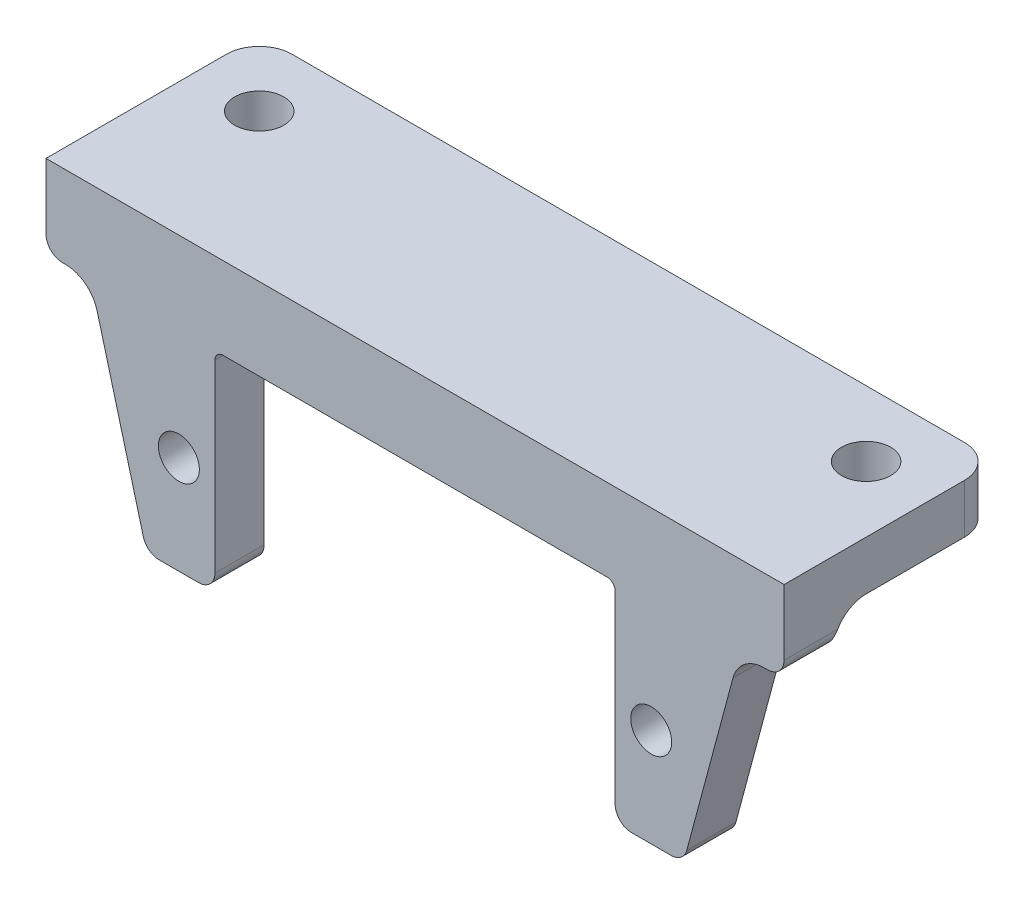
ISO-10303-21;
HEADER;
FILE_DESCRIPTION(('STEP AP214'),'2;1');
FILE_NAME('part.step','',(''),(''),'','','');
FILE_SCHEMA(('AUTOMOTIVE_DESIGN { 1 0 10303 214 1 1 1 1 }'));
ENDSEC;
DATA;
#1=APPLICATION_CONTEXT('core data for automotive mechanical design processes');
#2=APPLICATION_PROTOCOL_DEFINITION('international standard','automotive_design',2000,#1);
#3=PRODUCT_CONTEXT('',#1,'mechanical');
#4=PRODUCT('Part','Part','',(#3));
#5=PRODUCT_RELATED_PRODUCT_CATEGORY('part','',(#4));
#6=PRODUCT_DEFINITION_FORMATION('','',#4);
#7=PRODUCT_DEFINITION_CONTEXT('part definition',#1,'design');
#8=PRODUCT_DEFINITION('design','',#6,#7);
#9=PRODUCT_DEFINITION_SHAPE('','',#8);
#10=(LENGTH_UNIT() NAMED_UNIT(*) SI_UNIT(.MILLI.,.METRE.));
#11=(NAMED_UNIT(*) PLANE_ANGLE_UNIT() SI_UNIT($,.RADIAN.));
#12=(NAMED_UNIT(*) SI_UNIT($,.STERADIAN.) SOLID_ANGLE_UNIT());
#13=UNCERTAINTY_MEASURE_WITH_UNIT(LENGTH_MEASURE(1.E-05),#10,'distance_accuracy_value','');
#14=(GEOMETRIC_REPRESENTATION_CONTEXT(3) GLOBAL_UNCERTAINTY_ASSIGNED_CONTEXT((#13)) GLOBAL_UNIT_ASSIGNED_CONTEXT((#10,
#11,#12)) REPRESENTATION_CONTEXT('',''));
#15=CARTESIAN_POINT('',(0.,0.,0.));
#16=DIRECTION('',(0.,0.,1.));
#17=DIRECTION('',(1.,0.,0.));
#18=AXIS2_PLACEMENT_3D('',#15,#16,#17);
#19=CARTESIAN_POINT('',(15.6,-5.,0.));
#20=DIRECTION('',(0.,0.,-1.));
#21=DIRECTION('',(-1.,0.,0.));
#22=AXIS2_PLACEMENT_3D('',#19,#20,#21);
#23=PLANE('',#22);
#24=CARTESIAN_POINT('',(-14.4,0.,0.));
#25=DIRECTION('',(0.,0.,1.));
#26=DIRECTION('',(1.,0.,0.));
#27=AXIS2_PLACEMENT_3D('',#24,#25,#26);
#28=CIRCLE('',#27,1.25);
#29=CARTESIAN_POINT('',(-13.15,0.,0.));
#30=VERTEX_POINT('',#29);
#31=EDGE_CURVE('E312',#30,#30,#28,.T.);
#32=ORIENTED_EDGE('',*,*,#31,.T.);
#33=EDGE_LOOP('',(#32));
#34=FACE_BOUND('',#33,.T.);
#35=CARTESIAN_POINT('',(-21.3183331674337,4.75,0.));
#36=DIRECTION('',(0.,0.,-1.));
#37=DIRECTION('',(1.,0.,0.));
#38=AXIS2_PLACEMENT_3D('',#35,#36,#37);
#39=CIRCLE('',#38,2.);
#40=CARTESIAN_POINT('',(-21.3183331674337,6.75,0.));
#41=VERTEX_POINT('',#40);
#42=CARTESIAN_POINT('',(-19.3864815148555,5.26763809020503,0.));
#43=VERTEX_POINT('',#42);
#44=EDGE_CURVE('E370',#41,#43,#39,.T.);
#45=ORIENTED_EDGE('',*,*,#44,.F.);
#46=DIRECTION('',(-1.,0.,0.));
#47=VECTOR('',#46,1.);
#48=CARTESIAN_POINT('',(15.6,6.75,0.));
#49=LINE('',#48,#47);
#50=CARTESIAN_POINT('',(-11.7,6.75,0.));
#51=VERTEX_POINT('',#50);
#52=EDGE_CURVE('E242',#41,#51,#49,.F.);
#53=ORIENTED_EDGE('',*,*,#52,.T.);
#54=CARTESIAN_POINT('',(-11.7,6.25,0.));
#55=DIRECTION('',(0.,0.,-1.));
#56=DIRECTION('',(1.,0.,0.));
#57=AXIS2_PLACEMENT_3D('',#54,#55,#56);
#58=CIRCLE('',#57,0.5);
#59=CARTESIAN_POINT('',(-12.2,6.25,0.));
#60=VERTEX_POINT('',#59);
#61=EDGE_CURVE('E382',#60,#51,#58,.T.);
#62=ORIENTED_EDGE('',*,*,#61,.F.);
#63=DIRECTION('',(0.,1.,0.));
#64=VECTOR('',#63,1.);
#65=CARTESIAN_POINT('',(-12.2,6.25,0.));
#66=LINE('',#65,#64);
#67=CARTESIAN_POINT('',(-12.2,-5.,0.));
#68=VERTEX_POINT('',#67);
#69=EDGE_CURVE('E380',#68,#60,#66,.T.);
#70=ORIENTED_EDGE('',*,*,#69,.F.);
#71=CARTESIAN_POINT('',(-13.2,-5.,0.));
#72=DIRECTION('',(0.,0.,1.));
#73=DIRECTION('',(-1.,0.,0.));
#74=AXIS2_PLACEMENT_3D('',#71,#72,#73);
#75=CIRCLE('',#74,0.999999999999999);
#76=CARTESIAN_POINT('',(-13.2,-6.,0.));
#77=VERTEX_POINT('',#76);
#78=EDGE_CURVE('E378',#77,#68,#75,.T.);
#79=ORIENTED_EDGE('',*,*,#78,.F.);
#80=DIRECTION('',(1.,0.,0.));
#81=VECTOR('',#80,1.);
#82=CARTESIAN_POINT('',(-13.2,-6.,0.));
#83=LINE('',#82,#81);
#84=CARTESIAN_POINT('',(-15.6,-6.,0.));
#85=VERTEX_POINT('',#84);
#86=EDGE_CURVE('E376',#85,#77,#83,.T.);
#87=ORIENTED_EDGE('',*,*,#86,.F.);
#88=CARTESIAN_POINT('',(-15.6,-5.,0.));
#89=DIRECTION('',(0.,0.,1.));
#90=DIRECTION('',(-1.,0.,0.));
#91=AXIS2_PLACEMENT_3D('',#88,#89,#90);
#92=CIRCLE('',#91,0.999999999999999);
#93=CARTESIAN_POINT('',(-16.5659258262891,-5.25881904510252,0.));
#94=VERTEX_POINT('',#93);
#95=EDGE_CURVE('E374',#94,#85,#92,.T.);
#96=ORIENTED_EDGE('',*,*,#95,.F.);
#97=DIRECTION('',(0.258819045102518,-0.965925826289069,0.));
#98=VECTOR('',#97,1.);
#99=CARTESIAN_POINT('',(-16.5659258262891,-5.25881904510252,0.));
#100=LINE('',#99,#98);
#101=EDGE_CURVE('E372',#43,#94,#100,.T.);
#102=ORIENTED_EDGE('',*,*,#101,.F.);
#103=EDGE_LOOP('',(#45,#53,#62,#70,#79,#87,#96,#102));
#104=FACE_BOUND('',#103,.T.);
#105=ADVANCED_FACE('F33',(#34,#104),#23,.T.);
#106=CARTESIAN_POINT('',(15.6,-5.,3.));
#107=DIRECTION('',(0.,0.,-1.));
#108=DIRECTION('',(-1.,0.,0.));
#109=AXIS2_PLACEMENT_3D('',#106,#107,#108);
#110=PLANE('',#109);
#111=CARTESIAN_POINT('',(15.6,-5.,3.));
#112=DIRECTION('',(0.,0.,1.));
#113=DIRECTION('',(-1.,0.,0.));
#114=AXIS2_PLACEMENT_3D('',#111,#112,#113);
#115=CIRCLE('',#114,1.);
#116=CARTESIAN_POINT('',(15.6,-6.,3.));
#117=VERTEX_POINT('',#116);
#118=CARTESIAN_POINT('',(16.5659258262891,-5.25881904510252,3.));
#119=VERTEX_POINT('',#118);
#120=EDGE_CURVE('E217',#117,#119,#115,.T.);
#121=ORIENTED_EDGE('',*,*,#120,.T.);
#122=DIRECTION('',(0.258819045102518,0.965925826289069,0.));
#123=VECTOR('',#122,1.);
#124=CARTESIAN_POINT('',(16.5659258262891,-5.25881904510252,3.));
#125=LINE('',#124,#123);
#126=CARTESIAN_POINT('',(19.3864815148555,5.26763809020502,3.));
#127=VERTEX_POINT('',#126);
#128=EDGE_CURVE('E206',#119,#127,#125,.T.);
#129=ORIENTED_EDGE('',*,*,#128,.T.);
#130=CARTESIAN_POINT('',(21.3183331674337,4.75,3.));
#131=DIRECTION('',(0.,0.,-1.));
#132=DIRECTION('',(1.,0.,0.));
#133=AXIS2_PLACEMENT_3D('',#130,#131,#132);
#134=CIRCLE('',#133,2.);
#135=CARTESIAN_POINT('',(21.3183331674337,6.75,3.));
#136=VERTEX_POINT('',#135);
#137=EDGE_CURVE('E216',#127,#136,#134,.T.);
#138=ORIENTED_EDGE('',*,*,#137,.T.);
#139=DIRECTION('',(1.,0.,0.));
#140=VECTOR('',#139,1.);
#141=CARTESIAN_POINT('',(21.3183331674337,6.75,3.));
#142=LINE('',#141,#140);
#143=CARTESIAN_POINT('',(21.5,6.75,3.));
#144=VERTEX_POINT('',#143);
#145=EDGE_CURVE('E322',#136,#144,#142,.T.);
#146=ORIENTED_EDGE('',*,*,#145,.T.);
#147=CARTESIAN_POINT('',(21.5,7.75,3.));
#148=DIRECTION('',(0.,0.,1.));
#149=DIRECTION('',(-1.,0.,0.));
#150=AXIS2_PLACEMENT_3D('',#147,#148,#149);
#151=CIRCLE('',#150,1.);
#152=CARTESIAN_POINT('',(22.5,7.75,3.));
#153=VERTEX_POINT('',#152);
#154=EDGE_CURVE('E324',#144,#153,#151,.T.);
#155=ORIENTED_EDGE('',*,*,#154,.T.);
#156=DIRECTION('',(0.,1.,0.));
#157=VECTOR('',#156,1.);
#158=CARTESIAN_POINT('',(22.5,7.75,3.));
#159=LINE('',#158,#157);
#160=CARTESIAN_POINT('',(22.5,11.75,3.));
#161=VERTEX_POINT('',#160);
#162=EDGE_CURVE('E326',#153,#161,#159,.T.);
#163=ORIENTED_EDGE('',*,*,#162,.T.);
#164=DIRECTION('',(-1.,0.,0.));
#165=VECTOR('',#164,1.);
#166=CARTESIAN_POINT('',(-22.5,11.75,3.));
#167=LINE('',#166,#165);
#168=CARTESIAN_POINT('',(-22.5,11.75,3.));
#169=VERTEX_POINT('',#168);
#170=EDGE_CURVE('E328',#161,#169,#167,.T.);
#171=ORIENTED_EDGE('',*,*,#170,.T.);
#172=DIRECTION('',(0.,-1.,0.));
#173=VECTOR('',#172,1.);
#174=CARTESIAN_POINT('',(-22.5,7.75,3.));
#175=LINE('',#174,#173);
#176=CARTESIAN_POINT('',(-22.5,7.75,3.));
#177=VERTEX_POINT('',#176);
#178=EDGE_CURVE('E330',#169,#177,#175,.T.);
#179=ORIENTED_EDGE('',*,*,#178,.T.);
#180=CARTESIAN_POINT('',(-21.5,7.75,3.));
#181=DIRECTION('',(0.,0.,1.));
#182=DIRECTION('',(-1.,0.,0.));
#183=AXIS2_PLACEMENT_3D('',#180,#181,#182);
#184=CIRCLE('',#183,1.);
#185=CARTESIAN_POINT('',(-21.5,6.75,3.));
#186=VERTEX_POINT('',#185);
#187=EDGE_CURVE('E332',#177,#186,#184,.T.);
#188=ORIENTED_EDGE('',*,*,#187,.T.);
#189=DIRECTION('',(1.,0.,0.));
#190=VECTOR('',#189,1.);
#191=CARTESIAN_POINT('',(-21.3183331674337,6.75,3.));
#192=LINE('',#191,#190);
#193=CARTESIAN_POINT('',(-21.3183331674337,6.75,3.));
#194=VERTEX_POINT('',#193);
#195=EDGE_CURVE('E334',#186,#194,#192,.T.);
#196=ORIENTED_EDGE('',*,*,#195,.T.);
#197=CARTESIAN_POINT('',(-21.3183331674337,4.75,3.));
#198=DIRECTION('',(0.,0.,-1.));
#199=DIRECTION('',(1.,0.,0.));
#200=AXIS2_PLACEMENT_3D('',#197,#198,#199);
#201=CIRCLE('',#200,2.);
#202=CARTESIAN_POINT('',(-19.3864815148555,5.26763809020503,3.));
#203=VERTEX_POINT('',#202);
#204=EDGE_CURVE('E336',#194,#203,#201,.T.);
#205=ORIENTED_EDGE('',*,*,#204,.T.);
#206=DIRECTION('',(0.258819045102518,-0.965925826289069,0.));
#207=VECTOR('',#206,1.);
#208=CARTESIAN_POINT('',(-16.5659258262891,-5.25881904510252,3.));
#209=LINE('',#208,#207);
#210=CARTESIAN_POINT('',(-16.5659258262891,-5.25881904510252,3.));
#211=VERTEX_POINT('',#210);
#212=EDGE_CURVE('E338',#203,#211,#209,.T.);
#213=ORIENTED_EDGE('',*,*,#212,.T.);
#214=CARTESIAN_POINT('',(-15.6,-5.,3.));
#215=DIRECTION('',(0.,0.,1.));
#216=DIRECTION('',(-1.,0.,0.));
#217=AXIS2_PLACEMENT_3D('',#214,#215,#216);
#218=CIRCLE('',#217,0.999999999999999);
#219=CARTESIAN_POINT('',(-15.6,-6.,3.));
#220=VERTEX_POINT('',#219);
#221=EDGE_CURVE('E340',#211,#220,#218,.T.);
#222=ORIENTED_EDGE('',*,*,#221,.T.);
#223=DIRECTION('',(1.,0.,0.));
#224=VECTOR('',#223,1.);
#225=CARTESIAN_POINT('',(-13.2,-6.,3.));
#226=LINE('',#225,#224);
#227=CARTESIAN_POINT('',(-13.2,-6.,3.));
#228=VERTEX_POINT('',#227);
#229=EDGE_CURVE('E342',#220,#228,#226,.T.);
#230=ORIENTED_EDGE('',*,*,#229,.T.);
#231=CARTESIAN_POINT('',(-13.2,-5.,3.));
#232=DIRECTION('',(0.,0.,1.));
#233=DIRECTION('',(-1.,0.,0.));
#234=AXIS2_PLACEMENT_3D('',#231,#232,#233);
#235=CIRCLE('',#234,0.999999999999999);
#236=CARTESIAN_POINT('',(-12.2,-5.,3.));
#237=VERTEX_POINT('',#236);
#238=EDGE_CURVE('E344',#228,#237,#235,.T.);
#239=ORIENTED_EDGE('',*,*,#238,.T.);
#240=DIRECTION('',(0.,1.,0.));
#241=VECTOR('',#240,1.);
#242=CARTESIAN_POINT('',(-12.2,6.25,3.));
#243=LINE('',#242,#241);
#244=CARTESIAN_POINT('',(-12.2,6.25,3.));
#245=VERTEX_POINT('',#244);
#246=EDGE_CURVE('E346',#237,#245,#243,.T.);
#247=ORIENTED_EDGE('',*,*,#246,.T.);
#248=CARTESIAN_POINT('',(-11.7,6.25,3.));
#249=DIRECTION('',(0.,0.,-1.));
#250=DIRECTION('',(1.,0.,0.));
#251=AXIS2_PLACEMENT_3D('',#248,#249,#250);
#252=CIRCLE('',#251,0.5);
#253=CARTESIAN_POINT('',(-11.7,6.75,3.));
#254=VERTEX_POINT('',#253);
#255=EDGE_CURVE('E348',#245,#254,#252,.T.);
#256=ORIENTED_EDGE('',*,*,#255,.T.);
#257=DIRECTION('',(1.,0.,0.));
#258=VECTOR('',#257,1.);
#259=CARTESIAN_POINT('',(-11.7,6.75,3.));
#260=LINE('',#259,#258);
#261=CARTESIAN_POINT('',(11.7,6.75,3.));
#262=VERTEX_POINT('',#261);
#263=EDGE_CURVE('E350',#254,#262,#260,.T.);
#264=ORIENTED_EDGE('',*,*,#263,.T.);
#265=CARTESIAN_POINT('',(11.7,6.25,3.));
#266=DIRECTION('',(0.,0.,-1.));
#267=DIRECTION('',(1.,0.,0.));
#268=AXIS2_PLACEMENT_3D('',#265,#266,#267);
#269=CIRCLE('',#268,0.5);
#270=CARTESIAN_POINT('',(12.2,6.25,3.));
#271=VERTEX_POINT('',#270);
#272=EDGE_CURVE('E352',#262,#271,#269,.T.);
#273=ORIENTED_EDGE('',*,*,#272,.T.);
#274=DIRECTION('',(0.,-1.,0.));
#275=VECTOR('',#274,1.);
#276=CARTESIAN_POINT('',(12.2,6.25,3.));
#277=LINE('',#276,#275);
#278=CARTESIAN_POINT('',(12.2,-4.99999999999999,3.));
#279=VERTEX_POINT('',#278);
#280=EDGE_CURVE('E354',#271,#279,#277,.T.);
#281=ORIENTED_EDGE('',*,*,#280,.T.);
#282=CARTESIAN_POINT('',(13.2,-5.,3.));
#283=DIRECTION('',(0.,0.,1.));
#284=DIRECTION('',(-1.,0.,0.));
#285=AXIS2_PLACEMENT_3D('',#282,#283,#284);
#286=CIRCLE('',#285,1.);
#287=CARTESIAN_POINT('',(13.2,-6.,3.));
#288=VERTEX_POINT('',#287);
#289=EDGE_CURVE('E356',#279,#288,#286,.T.);
#290=ORIENTED_EDGE('',*,*,#289,.T.);
#291=DIRECTION('',(1.,0.,0.));
#292=VECTOR('',#291,1.);
#293=CARTESIAN_POINT('',(13.2,-6.,3.));
#294=LINE('',#293,#292);
#295=EDGE_CURVE('E223',#288,#117,#294,.T.);
#296=ORIENTED_EDGE('',*,*,#295,.T.);
#297=EDGE_LOOP('',(#121,#129,#138,#146,#155,#163,#171,#179,#188,#196,#205,#213,#222,#230,#239,
#247,#256,#264,#273,#281,#290,#296));
#298=FACE_BOUND('',#297,.T.);
#299=CARTESIAN_POINT('',(-14.4,0.,3.));
#300=DIRECTION('',(0.,0.,1.));
#301=DIRECTION('',(1.,0.,0.));
#302=AXIS2_PLACEMENT_3D('',#299,#300,#301);
#303=CIRCLE('',#302,1.25);
#304=CARTESIAN_POINT('',(-13.15,0.,3.));
#305=VERTEX_POINT('',#304);
#306=EDGE_CURVE('E317',#305,#305,#303,.T.);
#307=ORIENTED_EDGE('',*,*,#306,.F.);
#308=EDGE_LOOP('',(#307));
#309=FACE_BOUND('',#308,.T.);
#310=CARTESIAN_POINT('',(14.4,0.,3.));
#311=DIRECTION('',(0.,0.,1.));
#312=DIRECTION('',(1.,0.,0.));
#313=AXIS2_PLACEMENT_3D('',#310,#311,#312);
#314=CIRCLE('',#313,1.25);
#315=CARTESIAN_POINT('',(15.65,0.,3.));
#316=VERTEX_POINT('',#315);
#317=EDGE_CURVE('E308',#316,#316,#314,.T.);
#318=ORIENTED_EDGE('',*,*,#317,.F.);
#319=EDGE_LOOP('',(#318));
#320=FACE_BOUND('',#319,.T.);
#321=ADVANCED_FACE('F220',(#298,#309,#320),#110,.F.);
#322=CARTESIAN_POINT('',(11.7,6.25,0.));
#323=DIRECTION('',(0.,0.,-1.));
#324=DIRECTION('',(1.,0.,0.));
#325=AXIS2_PLACEMENT_3D('',#322,#323,#324);
#326=CIRCLE('',#325,0.5);
#327=CARTESIAN_POINT('',(11.7,6.75,0.));
#328=VERTEX_POINT('',#327);
#329=CARTESIAN_POINT('',(12.2,6.25,0.));
#330=VERTEX_POINT('',#329);
#331=EDGE_CURVE('E302',#328,#330,#326,.T.);
#332=ORIENTED_EDGE('',*,*,#331,.F.);
#333=DIRECTION('',(-1.,0.,0.));
#334=VECTOR('',#333,1.);
#335=CARTESIAN_POINT('',(15.6,6.75,0.));
#336=LINE('',#335,#334);
#337=CARTESIAN_POINT('',(21.3183331674337,6.75,0.));
#338=VERTEX_POINT('',#337);
#339=EDGE_CURVE('E235',#328,#338,#336,.F.);
#340=ORIENTED_EDGE('',*,*,#339,.T.);
#341=CARTESIAN_POINT('',(21.3183331674337,4.75,0.));
#342=DIRECTION('',(0.,0.,-1.));
#343=DIRECTION('',(1.,0.,0.));
#344=AXIS2_PLACEMENT_3D('',#341,#342,#343);
#345=CIRCLE('',#344,2.);
#346=CARTESIAN_POINT('',(19.3864815148555,5.26763809020502,0.));
#347=VERTEX_POINT('',#346);
#348=EDGE_CURVE('E363',#347,#338,#345,.T.);
#349=ORIENTED_EDGE('',*,*,#348,.F.);
#350=DIRECTION('',(0.258819045102518,0.965925826289069,0.));
#351=VECTOR('',#350,1.);
#352=CARTESIAN_POINT('',(16.5659258262891,-5.25881904510252,0.));
#353=LINE('',#352,#351);
#354=CARTESIAN_POINT('',(16.5659258262891,-5.25881904510252,0.));
#355=VERTEX_POINT('',#354);
#356=EDGE_CURVE('E361',#355,#347,#353,.T.);
#357=ORIENTED_EDGE('',*,*,#356,.F.);
#358=CARTESIAN_POINT('',(15.6,-5.,0.));
#359=DIRECTION('',(0.,0.,1.));
#360=DIRECTION('',(-1.,0.,0.));
#361=AXIS2_PLACEMENT_3D('',#358,#359,#360);
#362=CIRCLE('',#361,1.);
#363=CARTESIAN_POINT('',(15.6,-6.,0.));
#364=VERTEX_POINT('',#363);
#365=EDGE_CURVE('E231',#364,#355,#362,.T.);
#366=ORIENTED_EDGE('',*,*,#365,.F.);
#367=DIRECTION('',(1.,0.,0.));
#368=VECTOR('',#367,1.);
#369=CARTESIAN_POINT('',(13.2,-6.,0.));
#370=LINE('',#369,#368);
#371=CARTESIAN_POINT('',(13.2,-6.,0.));
#372=VERTEX_POINT('',#371);
#373=EDGE_CURVE('E227',#372,#364,#370,.T.);
#374=ORIENTED_EDGE('',*,*,#373,.F.);
#375=CARTESIAN_POINT('',(13.2,-5.,0.));
#376=DIRECTION('',(0.,0.,1.));
#377=DIRECTION('',(-1.,0.,0.));
#378=AXIS2_PLACEMENT_3D('',#375,#376,#377);
#379=CIRCLE('',#378,1.);
#380=CARTESIAN_POINT('',(12.2,-4.99999999999999,0.));
#381=VERTEX_POINT('',#380);
#382=EDGE_CURVE('E390',#381,#372,#379,.T.);
#383=ORIENTED_EDGE('',*,*,#382,.F.);
#384=DIRECTION('',(0.,-1.,0.));
#385=VECTOR('',#384,1.);
#386=CARTESIAN_POINT('',(12.2,6.25,0.));
#387=LINE('',#386,#385);
#388=EDGE_CURVE('E388',#330,#381,#387,.T.);
#389=ORIENTED_EDGE('',*,*,#388,.F.);
#390=EDGE_LOOP('',(#332,#340,#349,#357,#366,#374,#383,#389));
#391=FACE_BOUND('',#390,.T.);
#392=CARTESIAN_POINT('',(14.4,0.,0.));
#393=DIRECTION('',(0.,0.,1.));
#394=DIRECTION('',(1.,0.,0.));
#395=AXIS2_PLACEMENT_3D('',#392,#393,#394);
#396=CIRCLE('',#395,1.25);
#397=CARTESIAN_POINT('',(15.65,0.,0.));
#398=VERTEX_POINT('',#397);
#399=EDGE_CURVE('E306',#398,#398,#396,.T.);
#400=ORIENTED_EDGE('',*,*,#399,.T.);
#401=EDGE_LOOP('',(#400));
#402=FACE_BOUND('',#401,.T.);
#403=ADVANCED_FACE('F286',(#391,#402),#23,.T.);
#404=CARTESIAN_POINT('',(15.6,-5.,3.));
#405=DIRECTION('',(0.,0.,-1.));
#406=DIRECTION('',(-1.,0.,0.));
#407=AXIS2_PLACEMENT_3D('',#404,#405,#406);
#408=CYLINDRICAL_SURFACE('',#407,1.);
#409=ORIENTED_EDGE('',*,*,#365,.T.);
#410=DIRECTION('',(0.,0.,-1.));
#411=VECTOR('',#410,1.);
#412=CARTESIAN_POINT('',(16.5659258262891,-5.25881904510252,3.));
#413=LINE('',#412,#411);
#414=EDGE_CURVE('E210',#119,#355,#413,.T.);
#415=ORIENTED_EDGE('',*,*,#414,.F.);
#416=ORIENTED_EDGE('',*,*,#120,.F.);
#417=DIRECTION('',(0.,0.,-1.));
#418=VECTOR('',#417,1.);
#419=CARTESIAN_POINT('',(15.6,-6.,3.));
#420=LINE('',#419,#418);
#421=EDGE_CURVE('E359',#117,#364,#420,.T.);
#422=ORIENTED_EDGE('',*,*,#421,.T.);
#423=EDGE_LOOP('',(#409,#415,#416,#422));
#424=FACE_BOUND('',#423,.T.);
#425=ADVANCED_FACE('F229',(#424),#408,.T.);
#426=CARTESIAN_POINT('',(16.5659258262891,-5.25881904510252,3.));
#427=DIRECTION('',(-0.965925826289069,0.258819045102518,0.));
#428=DIRECTION('',(-0.258819045102518,-0.965925826289069,0.));
#429=AXIS2_PLACEMENT_3D('',#426,#427,#428);
#430=PLANE('',#429);
#431=ORIENTED_EDGE('',*,*,#356,.T.);
#432=DIRECTION('',(0.,0.,-1.));
#433=VECTOR('',#432,1.);
#434=CARTESIAN_POINT('',(19.3864815148555,5.26763809020502,3.));
#435=LINE('',#434,#433);
#436=EDGE_CURVE('E213',#127,#347,#435,.T.);
#437=ORIENTED_EDGE('',*,*,#436,.F.);
#438=ORIENTED_EDGE('',*,*,#128,.F.);
#439=ORIENTED_EDGE('',*,*,#414,.T.);
#440=EDGE_LOOP('',(#431,#437,#438,#439));
#441=FACE_BOUND('',#440,.T.);
#442=ADVANCED_FACE('F208',(#441),#430,.F.);
#443=CARTESIAN_POINT('',(21.3183331674337,4.75,3.));
#444=DIRECTION('',(0.,0.,-1.));
#445=DIRECTION('',(-1.,0.,0.));
#446=AXIS2_PLACEMENT_3D('',#443,#444,#445);
#447=CYLINDRICAL_SURFACE('',#446,2.);
#448=ORIENTED_EDGE('',*,*,#348,.T.);
#449=DIRECTION('',(0.,0.,-1.));
#450=VECTOR('',#449,1.);
#451=CARTESIAN_POINT('',(21.3183331674337,6.75,3.));
#452=LINE('',#451,#450);
#453=EDGE_CURVE('E237',#136,#338,#452,.T.);
#454=ORIENTED_EDGE('',*,*,#453,.F.);
#455=ORIENTED_EDGE('',*,*,#137,.F.);
#456=ORIENTED_EDGE('',*,*,#436,.T.);
#457=EDGE_LOOP('',(#448,#454,#455,#456));
#458=FACE_BOUND('',#457,.T.);
#459=ADVANCED_FACE('F643',(#458),#447,.F.);
#460=CARTESIAN_POINT('',(21.3183331674337,6.75,3.));
#461=DIRECTION('',(0.,1.,0.));
#462=DIRECTION('',(0.,0.,1.));
#463=AXIS2_PLACEMENT_3D('',#460,#461,#462);
#464=PLANE('',#463);
#465=DIRECTION('',(1.,0.,0.));
#466=VECTOR('',#465,1.);
#467=CARTESIAN_POINT('',(21.3183331674337,6.75,0.));
#468=LINE('',#467,#466);
#469=CARTESIAN_POINT('',(21.5,6.75,0.));
#470=VERTEX_POINT('',#469);
#471=EDGE_CURVE('E366',#338,#470,#468,.T.);
#472=ORIENTED_EDGE('',*,*,#471,.T.);
#473=DIRECTION('',(0.,0.,-1.));
#474=VECTOR('',#473,1.);
#475=CARTESIAN_POINT('',(21.5,6.75,3.));
#476=LINE('',#475,#474);
#477=EDGE_CURVE('E442',#144,#470,#476,.T.);
#478=ORIENTED_EDGE('',*,*,#477,.F.);
#479=ORIENTED_EDGE('',*,*,#145,.F.);
#480=ORIENTED_EDGE('',*,*,#453,.T.);
#481=EDGE_LOOP('',(#472,#478,#479,#480));
#482=FACE_BOUND('',#481,.T.);
#483=ADVANCED_FACE('F449',(#482),#464,.F.);
#484=CARTESIAN_POINT('',(21.5,7.75,3.));
#485=DIRECTION('',(0.,0.,-1.));
#486=DIRECTION('',(-1.,0.,0.));
#487=AXIS2_PLACEMENT_3D('',#484,#485,#486);
#488=CYLINDRICAL_SURFACE('',#487,1.);
#489=ORIENTED_EDGE('',*,*,#477,.T.);
#490=CARTESIAN_POINT('',(21.5,6.75,0.));
#491=CARTESIAN_POINT('',(21.528064930657,6.75000019655651,-3.38457746343674E-06));
#492=CARTESIAN_POINT('',(21.556116435897,6.75118220116856,3.81699398860107E-07));
#493=CARTESIAN_POINT('',(21.6120199894212,6.7558977948124,-6.64730920224636E-06));
#494=CARTESIAN_POINT('',(21.6398720451429,6.75943129569095,-1.74420488156339E-05));
#495=CARTESIAN_POINT('',(21.7228071325513,6.77352987986107,-0.000114879654145302));
#496=CARTESIAN_POINT('',(21.7773370330427,6.7875931091928,-0.000266446057556471));
#497=CARTESIAN_POINT('',(21.8832717432356,6.8246579532952,-0.00130890238970298));
#498=CARTESIAN_POINT('',(21.9346746048291,6.84766507537099,-0.00220024823072294));
#499=CARTESIAN_POINT('',(22.0328646582971,6.90194417530105,-0.00559544551427728));
#500=CARTESIAN_POINT('',(22.0796525873315,6.93321483024579,-0.00809903894409179));
#501=CARTESIAN_POINT('',(22.166760180731,7.00267023030513,-0.0157213342118671));
#502=CARTESIAN_POINT('',(22.2071412663105,7.04078076965932,-0.020812950168902));
#503=CARTESIAN_POINT('',(22.2807721650838,7.12276360940399,-0.0346073675866449));
#504=CARTESIAN_POINT('',(22.3140275996886,7.16663132358522,-0.0433073064230306));
#505=CARTESIAN_POINT('',(22.371328545234,7.25653093811272,-0.0646783789907648));
#506=CARTESIAN_POINT('',(22.3956957360296,7.3024003870856,-0.077172086931046));
#507=CARTESIAN_POINT('',(22.4367118967516,7.39617446348932,-0.106623210898274));
#508=CARTESIAN_POINT('',(22.4533530083007,7.44408110919034,-0.123585144305968));
#509=CARTESIAN_POINT('',(22.4777978038813,7.5356520550736,-0.160178285326918));
#510=CARTESIAN_POINT('',(22.4862774823743,7.57929813295573,-0.179416528032347));
#511=CARTESIAN_POINT('',(22.497388526348,7.66561539313656,-0.221239559248235));
#512=CARTESIAN_POINT('',(22.5000324343407,7.70828847076812,-0.243817059132637));
#513=CARTESIAN_POINT('',(22.5,7.75,-0.267949192431122));
#514=B_SPLINE_CURVE_WITH_KNOTS('',3,(#490,#491,#492,#493,#494,#495,#496,#497,#498,#499,#500,
#501,#502,#503,#504,#505,#506,#507,#508,#509,#510,#511,#512,#513),.UNSPECIFIED.,.F.,.F.,(4,2,2,
2,2,2,2,2,2,2,2,4),(0.,0.084143237261813,0.168283320326866,0.33636222284005,0.504544786232023,
0.672700441560397,0.839131367163872,1.00543050837047,1.16491201656438,1.32455538369815,
1.46940628130604,1.61394555417827),.UNSPECIFIED.);
#515=CARTESIAN_POINT('',(22.5,7.75,-0.267949192431121));
#516=VERTEX_POINT('',#515);
#517=EDGE_CURVE('E255',#470,#516,#514,.T.);
#518=ORIENTED_EDGE('',*,*,#517,.T.);
#519=DIRECTION('',(0.,0.,-1.));
#520=VECTOR('',#519,1.);
#521=CARTESIAN_POINT('',(22.5,7.75,3.));
#522=LINE('',#521,#520);
#523=EDGE_CURVE('E440',#153,#516,#522,.T.);
#524=ORIENTED_EDGE('',*,*,#523,.F.);
#525=ORIENTED_EDGE('',*,*,#154,.F.);
#526=EDGE_LOOP('',(#489,#518,#524,#525));
#527=FACE_BOUND('',#526,.T.);
#528=ADVANCED_FACE('F645',(#527),#488,.T.);
#529=CARTESIAN_POINT('',(22.5,7.75,3.));
#530=DIRECTION('',(-1.,0.,0.));
#531=DIRECTION('',(0.,-1.,0.));
#532=AXIS2_PLACEMENT_3D('',#529,#530,#531);
#533=PLANE('',#532);
#534=DIRECTION('',(0.,0.,1.));
#535=VECTOR('',#534,1.);
#536=CARTESIAN_POINT('',(22.5,8.75,-10.));
#537=LINE('',#536,#535);
#538=CARTESIAN_POINT('',(22.5,8.75,-8.));
#539=VERTEX_POINT('',#538);
#540=CARTESIAN_POINT('',(22.5,8.75,-2.));
#541=VERTEX_POINT('',#540);
#542=EDGE_CURVE('E309',#539,#541,#537,.T.);
#543=ORIENTED_EDGE('',*,*,#542,.F.);
#544=DIRECTION('',(0.,-1.,0.));
#545=VECTOR('',#544,1.);
#546=CARTESIAN_POINT('',(22.5,11.75,-8.));
#547=LINE('',#546,#545);
#548=CARTESIAN_POINT('',(22.5,11.75,-8.));
#549=VERTEX_POINT('',#548);
#550=EDGE_CURVE('E11',#539,#549,#547,.F.);
#551=ORIENTED_EDGE('',*,*,#550,.T.);
#552=DIRECTION('',(0.,0.,-1.));
#553=VECTOR('',#552,1.);
#554=CARTESIAN_POINT('',(22.5,11.75,3.));
#555=LINE('',#554,#553);
#556=EDGE_CURVE('E437',#161,#549,#555,.T.);
#557=ORIENTED_EDGE('',*,*,#556,.F.);
#558=ORIENTED_EDGE('',*,*,#162,.F.);
#559=ORIENTED_EDGE('',*,*,#523,.T.);
#560=CARTESIAN_POINT('',(22.5,6.75,-2.));
#561=DIRECTION('',(-1.,0.,0.));
#562=DIRECTION('',(0.,-1.,0.));
#563=AXIS2_PLACEMENT_3D('',#560,#561,#562);
#564=CIRCLE('',#563,2.);
#565=EDGE_CURVE('E459',#516,#541,#564,.T.);
#566=ORIENTED_EDGE('',*,*,#565,.T.);
#567=EDGE_LOOP('',(#543,#551,#557,#558,#559,#566));
#568=FACE_BOUND('',#567,.T.);
#569=ADVANCED_FACE('F499',(#568),#533,.F.);
#570=CARTESIAN_POINT('',(-22.5,11.75,3.));
#571=DIRECTION('',(0.,-1.,0.));
#572=DIRECTION('',(0.,0.,-1.));
#573=AXIS2_PLACEMENT_3D('',#570,#571,#572);
#574=PLANE('',#573);
#575=CARTESIAN_POINT('',(18.5,11.75,-6.));
#576=DIRECTION('',(0.,1.,0.));
#577=DIRECTION('',(0.,0.,-1.));
#578=AXIS2_PLACEMENT_3D('',#575,#576,#577);
#579=CIRCLE('',#578,1.5);
#580=CARTESIAN_POINT('',(18.5,11.75,-7.5));
#581=VERTEX_POINT('',#580);
#582=EDGE_CURVE('E509',#581,#581,#579,.T.);
#583=ORIENTED_EDGE('',*,*,#582,.F.);
#584=EDGE_LOOP('',(#583));
#585=FACE_BOUND('',#584,.T.);
#586=CARTESIAN_POINT('',(-18.5,11.75,-6.));
#587=DIRECTION('',(0.,-1.,0.));
#588=DIRECTION('',(0.,0.,-1.));
#589=AXIS2_PLACEMENT_3D('',#586,#587,#588);
#590=CIRCLE('',#589,1.5);
#591=CARTESIAN_POINT('',(-18.5,11.75,-7.5));
#592=VERTEX_POINT('',#591);
#593=EDGE_CURVE('E484',#592,#592,#590,.T.);
#594=ORIENTED_EDGE('',*,*,#593,.T.);
#595=EDGE_LOOP('',(#594));
#596=FACE_BOUND('',#595,.T.);
#597=DIRECTION('',(1.,0.,0.));
#598=VECTOR('',#597,1.);
#599=CARTESIAN_POINT('',(22.5,11.75,-10.));
#600=LINE('',#599,#598);
#601=CARTESIAN_POINT('',(-20.5,11.75,-10.));
#602=VERTEX_POINT('',#601);
#603=CARTESIAN_POINT('',(20.5,11.75,-10.));
#604=VERTEX_POINT('',#603);
#605=EDGE_CURVE('E483',#602,#604,#600,.T.);
#606=ORIENTED_EDGE('',*,*,#605,.F.);
#607=CARTESIAN_POINT('',(-20.5,11.75,-8.));
#608=DIRECTION('',(0.,-1.,0.));
#609=DIRECTION('',(0.,0.,-1.));
#610=AXIS2_PLACEMENT_3D('',#607,#608,#609);
#611=CIRCLE('',#610,2.);
#612=CARTESIAN_POINT('',(-22.5,11.75,-8.));
#613=VERTEX_POINT('',#612);
#614=EDGE_CURVE('E472',#602,#613,#611,.F.);
#615=ORIENTED_EDGE('',*,*,#614,.T.);
#616=DIRECTION('',(0.,0.,-1.));
#617=VECTOR('',#616,1.);
#618=CARTESIAN_POINT('',(-22.5,11.75,3.));
#619=LINE('',#618,#617);
#620=EDGE_CURVE('E435',#169,#613,#619,.T.);
#621=ORIENTED_EDGE('',*,*,#620,.F.);
#622=ORIENTED_EDGE('',*,*,#170,.F.);
#623=ORIENTED_EDGE('',*,*,#556,.T.);
#624=CARTESIAN_POINT('',(20.5,11.75,-8.));
#625=DIRECTION('',(0.,-1.,0.));
#626=DIRECTION('',(0.,0.,-1.));
#627=AXIS2_PLACEMENT_3D('',#624,#625,#626);
#628=CIRCLE('',#627,2.);
#629=EDGE_CURVE('E470',#549,#604,#628,.F.);
#630=ORIENTED_EDGE('',*,*,#629,.T.);
#631=EDGE_LOOP('',(#606,#615,#621,#622,#623,#630));
#632=FACE_BOUND('',#631,.T.);
#633=ADVANCED_FACE('F488',(#585,#596,#632),#574,.F.);
#634=CARTESIAN_POINT('',(-22.5,7.75,3.));
#635=DIRECTION('',(1.,0.,0.));
#636=DIRECTION('',(0.,0.,-1.));
#637=AXIS2_PLACEMENT_3D('',#634,#635,#636);
#638=PLANE('',#637);
#639=ORIENTED_EDGE('',*,*,#620,.T.);
#640=DIRECTION('',(0.,1.,0.));
#641=VECTOR('',#640,1.);
#642=CARTESIAN_POINT('',(-22.5,8.75,-8.));
#643=LINE('',#642,#641);
#644=CARTESIAN_POINT('',(-22.5,8.75,-8.));
#645=VERTEX_POINT('',#644);
#646=EDGE_CURVE('E56',#613,#645,#643,.F.);
#647=ORIENTED_EDGE('',*,*,#646,.T.);
#648=DIRECTION('',(0.,0.,1.));
#649=VECTOR('',#648,1.);
#650=CARTESIAN_POINT('',(-22.5,8.75,-10.));
#651=LINE('',#650,#649);
#652=CARTESIAN_POINT('',(-22.5,8.75,-2.));
#653=VERTEX_POINT('',#652);
#654=EDGE_CURVE('E314',#645,#653,#651,.T.);
#655=ORIENTED_EDGE('',*,*,#654,.T.);
#656=CARTESIAN_POINT('',(-22.5,6.75,-2.));
#657=DIRECTION('',(1.,0.,0.));
#658=DIRECTION('',(0.,0.,-1.));
#659=AXIS2_PLACEMENT_3D('',#656,#657,#658);
#660=CIRCLE('',#659,2.);
#661=CARTESIAN_POINT('',(-22.5,7.75,-0.267949192431121));
#662=VERTEX_POINT('',#661);
#663=EDGE_CURVE('E244',#653,#662,#660,.T.);
#664=ORIENTED_EDGE('',*,*,#663,.T.);
#665=DIRECTION('',(0.,0.,-1.));
#666=VECTOR('',#665,1.);
#667=CARTESIAN_POINT('',(-22.5,7.75,3.));
#668=LINE('',#667,#666);
#669=EDGE_CURVE('E433',#177,#662,#668,.T.);
#670=ORIENTED_EDGE('',*,*,#669,.F.);
#671=ORIENTED_EDGE('',*,*,#178,.F.);
#672=EDGE_LOOP('',(#639,#647,#655,#664,#670,#671));
#673=FACE_BOUND('',#672,.T.);
#674=ADVANCED_FACE('F491',(#673),#638,.F.);
#675=CARTESIAN_POINT('',(-21.5,7.75,3.));
#676=DIRECTION('',(0.,0.,-1.));
#677=DIRECTION('',(-1.,0.,0.));
#678=AXIS2_PLACEMENT_3D('',#675,#676,#677);
#679=CYLINDRICAL_SURFACE('',#678,1.);
#680=ORIENTED_EDGE('',*,*,#669,.T.);
#681=CARTESIAN_POINT('',(-22.5,7.75,-0.267949192431121));
#682=CARTESIAN_POINT('',(-22.4999995287996,7.72590589023056,-0.254036403902623));
#683=CARTESIAN_POINT('',(-22.4991281414503,7.70152461449703,-0.24063322932604));
#684=CARTESIAN_POINT('',(-22.4955243809969,7.65232027071305,-0.214897961149277));
#685=CARTESIAN_POINT('',(-22.4927908615961,7.62749693971258,-0.202566532572994));
#686=CARTESIAN_POINT('',(-22.4816171573738,7.55259138750078,-0.167274688773986));
#687=CARTESIAN_POINT('',(-22.4702036668595,7.50208999424599,-0.146026144546779));
#688=CARTESIAN_POINT('',(-22.4388561776922,7.40167971529793,-0.108385692430872));
#689=CARTESIAN_POINT('',(-22.418888634699,7.35177396577126,-0.0920133393695889));
#690=CARTESIAN_POINT('',(-22.3705004695406,7.25486907917436,-0.064116062695305));
#691=CARTESIAN_POINT('',(-22.3420928798118,7.20786559483794,-0.0525837312705486));
#692=CARTESIAN_POINT('',(-22.2793705226885,7.12129428150313,-0.034297269187917));
#693=CARTESIAN_POINT('',(-22.2455035899333,7.08145128149865,-0.0273012121634986));
#694=CARTESIAN_POINT('',(-22.1717011100431,7.00733263300914,-0.0162693993693594));
#695=CARTESIAN_POINT('',(-22.1317617355461,6.97306052415534,-0.0122355200267847));
#696=CARTESIAN_POINT('',(-22.0462027825195,6.91064731222642,-0.00621093048617804));
#697=CARTESIAN_POINT('',(-22.0005006073505,6.88261628009861,-0.00425490454668397));
#698=CARTESIAN_POINT('',(-21.905186815053,6.83420389359403,-0.00162579173439133));
#699=CARTESIAN_POINT('',(-21.8555751418529,6.8138226489579,-0.000952723265797331));
#700=CARTESIAN_POINT('',(-21.7554991369276,6.78181606404217,-0.000190763490003023));
#701=CARTESIAN_POINT('',(-21.705125611952,6.76990891340727,-8.22269875368945E-05));
#702=CARTESIAN_POINT('',(-21.6286801981378,6.75797716561632,-1.24779518241999E-05));
#703=CARTESIAN_POINT('',(-21.6030396302356,6.75498807098204,-4.75431897230627E-06));
#704=CARTESIAN_POINT('',(-21.5516027817331,6.75099946056016,2.73076538221427E-07));
#705=CARTESIAN_POINT('',(-21.525806492723,6.75000005320852,-2.42372868292637E-06));
#706=CARTESIAN_POINT('',(-21.5,6.75,0.));
#707=B_SPLINE_CURVE_WITH_KNOTS('',3,(#681,#682,#683,#684,#685,#686,#687,#688,#689,#690,#691,
#692,#693,#694,#695,#696,#697,#698,#699,#700,#701,#702,#703,#704,#705,#706),.UNSPECIFIED.,.F.,
.F.,(4,2,2,2,2,2,2,2,2,2,2,2,4),(0.,0.083431235032773,0.166913875374152,0.333935213231278,
0.50161760113847,0.669042401376239,0.826581466672788,0.984220241103289,1.14445090900904,
1.30468387542887,1.45930167535491,1.53667730239237,1.61405714620782),.UNSPECIFIED.);
#708=CARTESIAN_POINT('',(-21.5,6.75,0.));
#709=VERTEX_POINT('',#708);
#710=EDGE_CURVE('E247',#662,#709,#707,.T.);
#711=ORIENTED_EDGE('',*,*,#710,.T.);
#712=DIRECTION('',(0.,0.,-1.));
#713=VECTOR('',#712,1.);
#714=CARTESIAN_POINT('',(-21.5,6.75,3.));
#715=LINE('',#714,#713);
#716=EDGE_CURVE('E430',#186,#709,#715,.T.);
#717=ORIENTED_EDGE('',*,*,#716,.F.);
#718=ORIENTED_EDGE('',*,*,#187,.F.);
#719=EDGE_LOOP('',(#680,#711,#717,#718));
#720=FACE_BOUND('',#719,.T.);
#721=ADVANCED_FACE('F262',(#720),#679,.T.);
#722=CARTESIAN_POINT('',(-21.3183331674337,6.75,3.));
#723=DIRECTION('',(0.,1.,0.));
#724=DIRECTION('',(0.,0.,1.));
#725=AXIS2_PLACEMENT_3D('',#722,#723,#724);
#726=PLANE('',#725);
#727=DIRECTION('',(1.,0.,0.));
#728=VECTOR('',#727,1.);
#729=CARTESIAN_POINT('',(-21.3183331674337,6.75,0.));
#730=LINE('',#729,#728);
#731=EDGE_CURVE('E368',#709,#41,#730,.T.);
#732=ORIENTED_EDGE('',*,*,#731,.T.);
#733=DIRECTION('',(0.,0.,-1.));
#734=VECTOR('',#733,1.);
#735=CARTESIAN_POINT('',(-21.3183331674337,6.75,3.));
#736=LINE('',#735,#734);
#737=EDGE_CURVE('E427',#194,#41,#736,.T.);
#738=ORIENTED_EDGE('',*,*,#737,.F.);
#739=ORIENTED_EDGE('',*,*,#195,.F.);
#740=ORIENTED_EDGE('',*,*,#716,.T.);
#741=EDGE_LOOP('',(#732,#738,#739,#740));
#742=FACE_BOUND('',#741,.T.);
#743=ADVANCED_FACE('F601',(#742),#726,.F.);
#744=CARTESIAN_POINT('',(-21.3183331674337,4.75,3.));
#745=DIRECTION('',(0.,0.,-1.));
#746=DIRECTION('',(-1.,0.,0.));
#747=AXIS2_PLACEMENT_3D('',#744,#745,#746);
#748=CYLINDRICAL_SURFACE('',#747,2.);
#749=ORIENTED_EDGE('',*,*,#44,.T.);
#750=DIRECTION('',(0.,0.,-1.));
#751=VECTOR('',#750,1.);
#752=CARTESIAN_POINT('',(-19.3864815148555,5.26763809020503,3.));
#753=LINE('',#752,#751);
#754=EDGE_CURVE('E424',#203,#43,#753,.T.);
#755=ORIENTED_EDGE('',*,*,#754,.F.);
#756=ORIENTED_EDGE('',*,*,#204,.F.);
#757=ORIENTED_EDGE('',*,*,#737,.T.);
#758=EDGE_LOOP('',(#749,#755,#756,#757));
#759=FACE_BOUND('',#758,.T.);
#760=ADVANCED_FACE('F598',(#759),#748,.F.);
#761=CARTESIAN_POINT('',(-16.5659258262891,-5.25881904510252,3.));
#762=DIRECTION('',(0.965925826289069,0.258819045102518,0.));
#763=DIRECTION('',(-0.258819045102518,0.965925826289069,0.));
#764=AXIS2_PLACEMENT_3D('',#761,#762,#763);
#765=PLANE('',#764);
#766=ORIENTED_EDGE('',*,*,#101,.T.);
#767=DIRECTION('',(0.,0.,-1.));
#768=VECTOR('',#767,1.);
#769=CARTESIAN_POINT('',(-16.5659258262891,-5.25881904510252,3.));
#770=LINE('',#769,#768);
#771=EDGE_CURVE('E421',#211,#94,#770,.T.);
#772=ORIENTED_EDGE('',*,*,#771,.F.);
#773=ORIENTED_EDGE('',*,*,#212,.F.);
#774=ORIENTED_EDGE('',*,*,#754,.T.);
#775=EDGE_LOOP('',(#766,#772,#773,#774));
#776=FACE_BOUND('',#775,.T.);
#777=ADVANCED_FACE('F594',(#776),#765,.F.);
#778=CARTESIAN_POINT('',(-15.6,-5.,3.));
#779=DIRECTION('',(0.,0.,-1.));
#780=DIRECTION('',(-1.,0.,0.));
#781=AXIS2_PLACEMENT_3D('',#778,#779,#780);
#782=CYLINDRICAL_SURFACE('',#781,0.999999999999999);
#783=ORIENTED_EDGE('',*,*,#95,.T.);
#784=DIRECTION('',(0.,0.,-1.));
#785=VECTOR('',#784,1.);
#786=CARTESIAN_POINT('',(-15.6,-6.,3.));
#787=LINE('',#786,#785);
#788=EDGE_CURVE('E418',#220,#85,#787,.T.);
#789=ORIENTED_EDGE('',*,*,#788,.F.);
#790=ORIENTED_EDGE('',*,*,#221,.F.);
#791=ORIENTED_EDGE('',*,*,#771,.T.);
#792=EDGE_LOOP('',(#783,#789,#790,#791));
#793=FACE_BOUND('',#792,.T.);
#794=ADVANCED_FACE('F590',(#793),#782,.T.);
#795=CARTESIAN_POINT('',(-13.2,-6.,3.));
#796=DIRECTION('',(0.,1.,0.));
#797=DIRECTION('',(0.,0.,1.));
#798=AXIS2_PLACEMENT_3D('',#795,#796,#797);
#799=PLANE('',#798);
#800=ORIENTED_EDGE('',*,*,#86,.T.);
#801=DIRECTION('',(0.,0.,-1.));
#802=VECTOR('',#801,1.);
#803=CARTESIAN_POINT('',(-13.2,-6.,3.));
#804=LINE('',#803,#802);
#805=EDGE_CURVE('E415',#228,#77,#804,.T.);
#806=ORIENTED_EDGE('',*,*,#805,.F.);
#807=ORIENTED_EDGE('',*,*,#229,.F.);
#808=ORIENTED_EDGE('',*,*,#788,.T.);
#809=EDGE_LOOP('',(#800,#806,#807,#808));
#810=FACE_BOUND('',#809,.T.);
#811=ADVANCED_FACE('F586',(#810),#799,.F.);
#812=CARTESIAN_POINT('',(-13.2,-5.,3.));
#813=DIRECTION('',(0.,0.,-1.));
#814=DIRECTION('',(-1.,0.,0.));
#815=AXIS2_PLACEMENT_3D('',#812,#813,#814);
#816=CYLINDRICAL_SURFACE('',#815,0.999999999999999);
#817=ORIENTED_EDGE('',*,*,#78,.T.);
#818=DIRECTION('',(0.,0.,-1.));
#819=VECTOR('',#818,1.);
#820=CARTESIAN_POINT('',(-12.2,-5.,3.));
#821=LINE('',#820,#819);
#822=EDGE_CURVE('E412',#237,#68,#821,.T.);
#823=ORIENTED_EDGE('',*,*,#822,.F.);
#824=ORIENTED_EDGE('',*,*,#238,.F.);
#825=ORIENTED_EDGE('',*,*,#805,.T.);
#826=EDGE_LOOP('',(#817,#823,#824,#825));
#827=FACE_BOUND('',#826,.T.);
#828=ADVANCED_FACE('F582',(#827),#816,.T.);
#829=CARTESIAN_POINT('',(-12.2,6.25,3.));
#830=DIRECTION('',(-1.,0.,0.));
#831=DIRECTION('',(0.,-1.,0.));
#832=AXIS2_PLACEMENT_3D('',#829,#830,#831);
#833=PLANE('',#832);
#834=ORIENTED_EDGE('',*,*,#69,.T.);
#835=DIRECTION('',(0.,0.,-1.));
#836=VECTOR('',#835,1.);
#837=CARTESIAN_POINT('',(-12.2,6.25,3.));
#838=LINE('',#837,#836);
#839=EDGE_CURVE('E409',#245,#60,#838,.T.);
#840=ORIENTED_EDGE('',*,*,#839,.F.);
#841=ORIENTED_EDGE('',*,*,#246,.F.);
#842=ORIENTED_EDGE('',*,*,#822,.T.);
#843=EDGE_LOOP('',(#834,#840,#841,#842));
#844=FACE_BOUND('',#843,.T.);
#845=ADVANCED_FACE('F578',(#844),#833,.F.);
#846=CARTESIAN_POINT('',(-11.7,6.25,3.));
#847=DIRECTION('',(0.,0.,-1.));
#848=DIRECTION('',(-1.,0.,0.));
#849=AXIS2_PLACEMENT_3D('',#846,#847,#848);
#850=CYLINDRICAL_SURFACE('',#849,0.5);
#851=ORIENTED_EDGE('',*,*,#61,.T.);
#852=DIRECTION('',(0.,0.,-1.));
#853=VECTOR('',#852,1.);
#854=CARTESIAN_POINT('',(-11.7,6.75,3.));
#855=LINE('',#854,#853);
#856=EDGE_CURVE('E406',#254,#51,#855,.T.);
#857=ORIENTED_EDGE('',*,*,#856,.F.);
#858=ORIENTED_EDGE('',*,*,#255,.F.);
#859=ORIENTED_EDGE('',*,*,#839,.T.);
#860=EDGE_LOOP('',(#851,#857,#858,#859));
#861=FACE_BOUND('',#860,.T.);
#862=ADVANCED_FACE('F574',(#861),#850,.F.);
#863=CARTESIAN_POINT('',(-11.7,6.75,3.));
#864=DIRECTION('',(0.,1.,0.));
#865=DIRECTION('',(0.,0.,1.));
#866=AXIS2_PLACEMENT_3D('',#863,#864,#865);
#867=PLANE('',#866);
#868=DIRECTION('',(1.,0.,0.));
#869=VECTOR('',#868,1.);
#870=CARTESIAN_POINT('',(-11.7,6.75,0.));
#871=LINE('',#870,#869);
#872=EDGE_CURVE('E385',#51,#328,#871,.T.);
#873=ORIENTED_EDGE('',*,*,#872,.T.);
#874=DIRECTION('',(0.,0.,-1.));
#875=VECTOR('',#874,1.);
#876=CARTESIAN_POINT('',(11.7,6.75,3.));
#877=LINE('',#876,#875);
#878=EDGE_CURVE('E403',#262,#328,#877,.T.);
#879=ORIENTED_EDGE('',*,*,#878,.F.);
#880=ORIENTED_EDGE('',*,*,#263,.F.);
#881=ORIENTED_EDGE('',*,*,#856,.T.);
#882=EDGE_LOOP('',(#873,#879,#880,#881));
#883=FACE_BOUND('',#882,.T.);
#884=ADVANCED_FACE('F570',(#883),#867,.F.);
#885=CARTESIAN_POINT('',(11.7,6.25,3.));
#886=DIRECTION('',(0.,0.,-1.));
#887=DIRECTION('',(-1.,0.,0.));
#888=AXIS2_PLACEMENT_3D('',#885,#886,#887);
#889=CYLINDRICAL_SURFACE('',#888,0.5);
#890=ORIENTED_EDGE('',*,*,#331,.T.);
#891=DIRECTION('',(0.,0.,-1.));
#892=VECTOR('',#891,1.);
#893=CARTESIAN_POINT('',(12.2,6.25,3.));
#894=LINE('',#893,#892);
#895=EDGE_CURVE('E400',#271,#330,#894,.T.);
#896=ORIENTED_EDGE('',*,*,#895,.F.);
#897=ORIENTED_EDGE('',*,*,#272,.F.);
#898=ORIENTED_EDGE('',*,*,#878,.T.);
#899=EDGE_LOOP('',(#890,#896,#897,#898));
#900=FACE_BOUND('',#899,.T.);
#901=ADVANCED_FACE('F566',(#900),#889,.F.);
#902=CARTESIAN_POINT('',(12.2,6.25,3.));
#903=DIRECTION('',(1.,0.,0.));
#904=DIRECTION('',(0.,1.,0.));
#905=AXIS2_PLACEMENT_3D('',#902,#903,#904);
#906=PLANE('',#905);
#907=ORIENTED_EDGE('',*,*,#388,.T.);
#908=DIRECTION('',(0.,0.,-1.));
#909=VECTOR('',#908,1.);
#910=CARTESIAN_POINT('',(12.2,-4.99999999999999,3.));
#911=LINE('',#910,#909);
#912=EDGE_CURVE('E397',#279,#381,#911,.T.);
#913=ORIENTED_EDGE('',*,*,#912,.F.);
#914=ORIENTED_EDGE('',*,*,#280,.F.);
#915=ORIENTED_EDGE('',*,*,#895,.T.);
#916=EDGE_LOOP('',(#907,#913,#914,#915));
#917=FACE_BOUND('',#916,.T.);
#918=ADVANCED_FACE('F560',(#917),#906,.F.);
#919=CARTESIAN_POINT('',(13.2,-5.,3.));
#920=DIRECTION('',(0.,0.,-1.));
#921=DIRECTION('',(-1.,0.,0.));
#922=AXIS2_PLACEMENT_3D('',#919,#920,#921);
#923=CYLINDRICAL_SURFACE('',#922,1.);
#924=ORIENTED_EDGE('',*,*,#382,.T.);
#925=DIRECTION('',(0.,0.,-1.));
#926=VECTOR('',#925,1.);
#927=CARTESIAN_POINT('',(13.2,-6.,3.));
#928=LINE('',#927,#926);
#929=EDGE_CURVE('E394',#288,#372,#928,.T.);
#930=ORIENTED_EDGE('',*,*,#929,.F.);
#931=ORIENTED_EDGE('',*,*,#289,.F.);
#932=ORIENTED_EDGE('',*,*,#912,.T.);
#933=EDGE_LOOP('',(#924,#930,#931,#932));
#934=FACE_BOUND('',#933,.T.);
#935=ADVANCED_FACE('F550',(#934),#923,.T.);
#936=CARTESIAN_POINT('',(13.2,-6.,3.));
#937=DIRECTION('',(0.,1.,0.));
#938=DIRECTION('',(0.,0.,1.));
#939=AXIS2_PLACEMENT_3D('',#936,#937,#938);
#940=PLANE('',#939);
#941=ORIENTED_EDGE('',*,*,#373,.T.);
#942=ORIENTED_EDGE('',*,*,#421,.F.);
#943=ORIENTED_EDGE('',*,*,#295,.F.);
#944=ORIENTED_EDGE('',*,*,#929,.T.);
#945=EDGE_LOOP('',(#941,#942,#943,#944));
#946=FACE_BOUND('',#945,.T.);
#947=ADVANCED_FACE('F545',(#946),#940,.F.);
#948=CARTESIAN_POINT('',(-14.4,0.,3.));
#949=DIRECTION('',(0.,0.,-1.));
#950=DIRECTION('',(-1.,0.,0.));
#951=AXIS2_PLACEMENT_3D('',#948,#949,#950);
#952=CYLINDRICAL_SURFACE('',#951,1.25);
#953=ORIENTED_EDGE('',*,*,#306,.T.);
#954=EDGE_LOOP('',(#953));
#955=FACE_BOUND('',#954,.T.);
#956=ORIENTED_EDGE('',*,*,#31,.F.);
#957=EDGE_LOOP('',(#956));
#958=FACE_BOUND('',#957,.T.);
#959=ADVANCED_FACE('F540',(#955,#958),#952,.F.);
#960=CARTESIAN_POINT('',(14.4,0.,3.));
#961=DIRECTION('',(0.,0.,-1.));
#962=DIRECTION('',(-1.,0.,0.));
#963=AXIS2_PLACEMENT_3D('',#960,#961,#962);
#964=CYLINDRICAL_SURFACE('',#963,1.25);
#965=ORIENTED_EDGE('',*,*,#317,.T.);
#966=EDGE_LOOP('',(#965));
#967=FACE_BOUND('',#966,.T.);
#968=ORIENTED_EDGE('',*,*,#399,.F.);
#969=EDGE_LOOP('',(#968));
#970=FACE_BOUND('',#969,.T.);
#971=ADVANCED_FACE('F532',(#967,#970),#964,.F.);
#972=CARTESIAN_POINT('',(22.5,8.75,-10.));
#973=DIRECTION('',(0.,1.,0.));
#974=DIRECTION('',(0.,0.,1.));
#975=AXIS2_PLACEMENT_3D('',#972,#973,#974);
#976=PLANE('',#975);
#977=CARTESIAN_POINT('',(18.5,8.75,-6.));
#978=DIRECTION('',(0.,1.,0.));
#979=DIRECTION('',(0.,0.,-1.));
#980=AXIS2_PLACEMENT_3D('',#977,#978,#979);
#981=CIRCLE('',#980,1.5);
#982=CARTESIAN_POINT('',(18.5,8.75,-7.5));
#983=VERTEX_POINT('',#982);
#984=EDGE_CURVE('E512',#983,#983,#981,.T.);
#985=ORIENTED_EDGE('',*,*,#984,.T.);
#986=EDGE_LOOP('',(#985));
#987=FACE_BOUND('',#986,.T.);
#988=CARTESIAN_POINT('',(-18.5,8.75,-6.));
#989=DIRECTION('',(0.,-1.,0.));
#990=DIRECTION('',(0.,0.,-1.));
#991=AXIS2_PLACEMENT_3D('',#988,#989,#990);
#992=CIRCLE('',#991,1.5);
#993=CARTESIAN_POINT('',(-18.5,8.75,-7.5));
#994=VERTEX_POINT('',#993);
#995=EDGE_CURVE('E506',#994,#994,#992,.T.);
#996=ORIENTED_EDGE('',*,*,#995,.F.);
#997=EDGE_LOOP('',(#996));
#998=FACE_BOUND('',#997,.T.);
#999=ORIENTED_EDGE('',*,*,#654,.F.);
#1000=CARTESIAN_POINT('',(-20.5,8.75,-8.));
#1001=DIRECTION('',(0.,1.,0.));
#1002=DIRECTION('',(0.,0.,1.));
#1003=AXIS2_PLACEMENT_3D('',#1000,#1001,#1002);
#1004=CIRCLE('',#1003,2.);
#1005=CARTESIAN_POINT('',(-20.5,8.75,-10.));
#1006=VERTEX_POINT('',#1005);
#1007=EDGE_CURVE('E41',#645,#1006,#1004,.F.);
#1008=ORIENTED_EDGE('',*,*,#1007,.T.);
#1009=DIRECTION('',(-1.,0.,0.));
#1010=VECTOR('',#1009,1.);
#1011=CARTESIAN_POINT('',(22.5,8.75,-10.));
#1012=LINE('',#1011,#1010);
#1013=CARTESIAN_POINT('',(20.5,8.75,-10.));
#1014=VERTEX_POINT('',#1013);
#1015=EDGE_CURVE('E477',#1014,#1006,#1012,.T.);
#1016=ORIENTED_EDGE('',*,*,#1015,.F.);
#1017=CARTESIAN_POINT('',(20.5,8.75,-8.));
#1018=DIRECTION('',(0.,1.,0.));
#1019=DIRECTION('',(0.,0.,1.));
#1020=AXIS2_PLACEMENT_3D('',#1017,#1018,#1019);
#1021=CIRCLE('',#1020,2.);
#1022=EDGE_CURVE('E48',#1014,#539,#1021,.F.);
#1023=ORIENTED_EDGE('',*,*,#1022,.T.);
#1024=ORIENTED_EDGE('',*,*,#542,.T.);
#1025=DIRECTION('',(-1.,0.,0.));
#1026=VECTOR('',#1025,1.);
#1027=CARTESIAN_POINT('',(22.5,8.75,-2.));
#1028=LINE('',#1027,#1026);
#1029=EDGE_CURVE('E232',#541,#653,#1028,.T.);
#1030=ORIENTED_EDGE('',*,*,#1029,.T.);
#1031=EDGE_LOOP('',(#999,#1008,#1016,#1023,#1024,#1030));
#1032=FACE_BOUND('',#1031,.T.);
#1033=ADVANCED_FACE('F476',(#987,#998,#1032),#976,.F.);
#1034=CARTESIAN_POINT('',(0.,0.,-10.));
#1035=DIRECTION('',(0.,0.,-1.));
#1036=DIRECTION('',(-1.,0.,0.));
#1037=AXIS2_PLACEMENT_3D('',#1034,#1035,#1036);
#1038=PLANE('',#1037);
#1039=ORIENTED_EDGE('',*,*,#1015,.T.);
#1040=DIRECTION('',(0.,1.,0.));
#1041=VECTOR('',#1040,1.);
#1042=CARTESIAN_POINT('',(-20.5,11.75,-10.));
#1043=LINE('',#1042,#1041);
#1044=EDGE_CURVE('E465',#1006,#602,#1043,.T.);
#1045=ORIENTED_EDGE('',*,*,#1044,.T.);
#1046=ORIENTED_EDGE('',*,*,#605,.T.);
#1047=DIRECTION('',(0.,-1.,0.));
#1048=VECTOR('',#1047,1.);
#1049=CARTESIAN_POINT('',(20.5,8.75,-10.));
#1050=LINE('',#1049,#1048);
#1051=EDGE_CURVE('E462',#604,#1014,#1050,.T.);
#1052=ORIENTED_EDGE('',*,*,#1051,.T.);
#1053=EDGE_LOOP('',(#1039,#1045,#1046,#1052));
#1054=FACE_BOUND('',#1053,.T.);
#1055=ADVANCED_FACE('F271',(#1054),#1038,.T.);
#1056=CARTESIAN_POINT('',(22.5,6.75,-2.));
#1057=DIRECTION('',(-1.,0.,0.));
#1058=DIRECTION('',(0.,0.,1.));
#1059=AXIS2_PLACEMENT_3D('',#1056,#1057,#1058);
#1060=CYLINDRICAL_SURFACE('',#1059,2.);
#1061=ORIENTED_EDGE('',*,*,#52,.F.);
#1062=ORIENTED_EDGE('',*,*,#731,.F.);
#1063=ORIENTED_EDGE('',*,*,#710,.F.);
#1064=ORIENTED_EDGE('',*,*,#663,.F.);
#1065=ORIENTED_EDGE('',*,*,#1029,.F.);
#1066=ORIENTED_EDGE('',*,*,#565,.F.);
#1067=ORIENTED_EDGE('',*,*,#517,.F.);
#1068=ORIENTED_EDGE('',*,*,#471,.F.);
#1069=ORIENTED_EDGE('',*,*,#339,.F.);
#1070=ORIENTED_EDGE('',*,*,#872,.F.);
#1071=EDGE_LOOP('',(#1061,#1062,#1063,#1064,#1065,#1066,#1067,#1068,#1069,#1070));
#1072=FACE_BOUND('',#1071,.T.);
#1073=ADVANCED_FACE('F266',(#1072),#1060,.F.);
#1074=CARTESIAN_POINT('',(-20.5,0.,-8.));
#1075=DIRECTION('',(0.,-1.,0.));
#1076=DIRECTION('',(0.,0.,-1.));
#1077=AXIS2_PLACEMENT_3D('',#1074,#1075,#1076);
#1078=CYLINDRICAL_SURFACE('',#1077,2.);
#1079=ORIENTED_EDGE('',*,*,#1007,.F.);
#1080=ORIENTED_EDGE('',*,*,#646,.F.);
#1081=ORIENTED_EDGE('',*,*,#614,.F.);
#1082=ORIENTED_EDGE('',*,*,#1044,.F.);
#1083=EDGE_LOOP('',(#1079,#1080,#1081,#1082));
#1084=FACE_BOUND('',#1083,.T.);
#1085=ADVANCED_FACE('F270',(#1084),#1078,.T.);
#1086=CARTESIAN_POINT('',(20.5,0.,-8.));
#1087=DIRECTION('',(0.,1.,0.));
#1088=DIRECTION('',(-1.,0.,0.));
#1089=AXIS2_PLACEMENT_3D('',#1086,#1087,#1088);
#1090=CYLINDRICAL_SURFACE('',#1089,2.);
#1091=ORIENTED_EDGE('',*,*,#629,.F.);
#1092=ORIENTED_EDGE('',*,*,#550,.F.);
#1093=ORIENTED_EDGE('',*,*,#1022,.F.);
#1094=ORIENTED_EDGE('',*,*,#1051,.F.);
#1095=EDGE_LOOP('',(#1091,#1092,#1093,#1094));
#1096=FACE_BOUND('',#1095,.T.);
#1097=ADVANCED_FACE('F35',(#1096),#1090,.T.);
#1098=CARTESIAN_POINT('',(-18.5,11.75,-6.));
#1099=DIRECTION('',(0.,-1.,0.));
#1100=DIRECTION('',(0.,0.,-1.));
#1101=AXIS2_PLACEMENT_3D('',#1098,#1099,#1100);
#1102=CYLINDRICAL_SURFACE('',#1101,1.5);
#1103=ORIENTED_EDGE('',*,*,#593,.F.);
#1104=EDGE_LOOP('',(#1103));
#1105=FACE_BOUND('',#1104,.T.);
#1106=ORIENTED_EDGE('',*,*,#995,.T.);
#1107=EDGE_LOOP('',(#1106));
#1108=FACE_BOUND('',#1107,.T.);
#1109=ADVANCED_FACE('F280',(#1105,#1108),#1102,.F.);
#1110=CARTESIAN_POINT('',(18.5,11.75,-6.));
#1111=DIRECTION('',(0.,-1.,0.));
#1112=DIRECTION('',(0.,0.,-1.));
#1113=AXIS2_PLACEMENT_3D('',#1110,#1111,#1112);
#1114=CYLINDRICAL_SURFACE('',#1113,1.5);
#1115=ORIENTED_EDGE('',*,*,#582,.T.);
#1116=EDGE_LOOP('',(#1115));
#1117=FACE_BOUND('',#1116,.T.);
#1118=ORIENTED_EDGE('',*,*,#984,.F.);
#1119=EDGE_LOOP('',(#1118));
#1120=FACE_BOUND('',#1119,.T.);
#1121=ADVANCED_FACE('F518',(#1117,#1120),#1114,.F.);
#1122=CLOSED_SHELL('',(#105,#321,#403,#425,#442,#459,#483,#528,#569,#633,#674,#721,#743,#760,
#777,#794,#811,#828,#845,#862,#884,#901,#918,#935,#947,#959,#971,#1033,#1055,#1073,#1085,#1097,
#1109,#1121));
#1123=MANIFOLD_SOLID_BREP('B2',#1122);
#1124=ADVANCED_BREP_SHAPE_REPRESENTATION('',(#18,#1123),#14);
#1125=SHAPE_DEFINITION_REPRESENTATION(#9,#1124);
ENDSEC;
END-ISO-10303-21;
